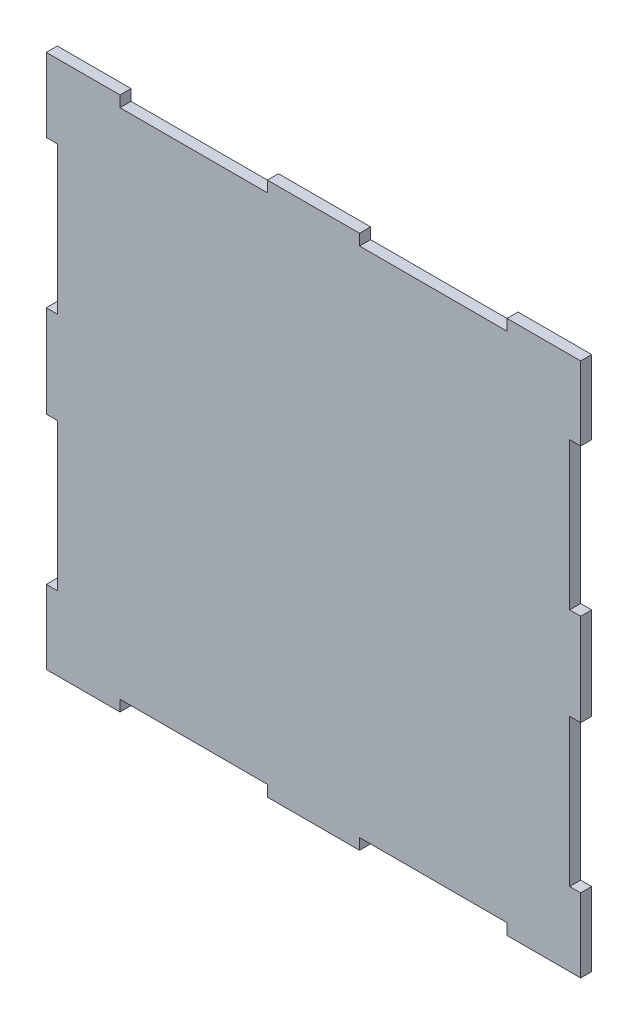
ISO-10303-21;
HEADER;
FILE_DESCRIPTION(('STEP AP214'),'2;1');
FILE_NAME('part.step','',(''),(''),'','','');
FILE_SCHEMA(('AUTOMOTIVE_DESIGN { 1 0 10303 214 1 1 1 1 }'));
ENDSEC;
DATA;
#1=APPLICATION_CONTEXT('core data for automotive mechanical design processes');
#2=APPLICATION_PROTOCOL_DEFINITION('international standard','automotive_design',2000,#1);
#3=PRODUCT_CONTEXT('',#1,'mechanical');
#4=PRODUCT('Part','Part','',(#3));
#5=PRODUCT_RELATED_PRODUCT_CATEGORY('part','',(#4));
#6=PRODUCT_DEFINITION_FORMATION('','',#4);
#7=PRODUCT_DEFINITION_CONTEXT('part definition',#1,'design');
#8=PRODUCT_DEFINITION('design','',#6,#7);
#9=PRODUCT_DEFINITION_SHAPE('','',#8);
#10=(LENGTH_UNIT() NAMED_UNIT(*) SI_UNIT(.MILLI.,.METRE.));
#11=(NAMED_UNIT(*) PLANE_ANGLE_UNIT() SI_UNIT($,.RADIAN.));
#12=(NAMED_UNIT(*) SI_UNIT($,.STERADIAN.) SOLID_ANGLE_UNIT());
#13=UNCERTAINTY_MEASURE_WITH_UNIT(LENGTH_MEASURE(1.E-05),#10,'distance_accuracy_value','');
#14=(GEOMETRIC_REPRESENTATION_CONTEXT(3) GLOBAL_UNCERTAINTY_ASSIGNED_CONTEXT((#13)) GLOBAL_UNIT_ASSIGNED_CONTEXT((#10,
#11,#12)) REPRESENTATION_CONTEXT('',''));
#15=CARTESIAN_POINT('',(0.,0.,0.));
#16=DIRECTION('',(0.,0.,1.));
#17=DIRECTION('',(1.,0.,0.));
#18=AXIS2_PLACEMENT_3D('',#15,#16,#17);
#19=CARTESIAN_POINT('',(72.5,72.5,3.));
#20=DIRECTION('',(-1.,0.,0.));
#21=DIRECTION('',(0.,-1.,0.));
#22=AXIS2_PLACEMENT_3D('',#19,#20,#21);
#23=PLANE('',#22);
#24=DIRECTION('',(0.,1.,0.));
#25=VECTOR('',#24,1.);
#26=CARTESIAN_POINT('',(72.5,72.5,3.));
#27=LINE('',#26,#25);
#28=CARTESIAN_POINT('',(72.5,-12.5,3.));
#29=VERTEX_POINT('',#28);
#30=CARTESIAN_POINT('',(72.5,12.5,3.));
#31=VERTEX_POINT('',#30);
#32=EDGE_CURVE('E377',#29,#31,#27,.T.);
#33=ORIENTED_EDGE('',*,*,#32,.F.);
#34=DIRECTION('',(0.,0.,1.));
#35=VECTOR('',#34,1.);
#36=CARTESIAN_POINT('',(72.5,-12.5,0.));
#37=LINE('',#36,#35);
#38=CARTESIAN_POINT('',(72.5,-12.5,0.));
#39=VERTEX_POINT('',#38);
#40=EDGE_CURVE('E406',#39,#29,#37,.T.);
#41=ORIENTED_EDGE('',*,*,#40,.F.);
#42=DIRECTION('',(0.,1.,0.));
#43=VECTOR('',#42,1.);
#44=CARTESIAN_POINT('',(72.5,72.5,0.));
#45=LINE('',#44,#43);
#46=CARTESIAN_POINT('',(72.5,12.5,0.));
#47=VERTEX_POINT('',#46);
#48=EDGE_CURVE('E345',#39,#47,#45,.T.);
#49=ORIENTED_EDGE('',*,*,#48,.T.);
#50=DIRECTION('',(0.,0.,1.));
#51=VECTOR('',#50,1.);
#52=CARTESIAN_POINT('',(72.5,12.5,0.));
#53=LINE('',#52,#51);
#54=EDGE_CURVE('E438',#47,#31,#53,.T.);
#55=ORIENTED_EDGE('',*,*,#54,.T.);
#56=EDGE_LOOP('',(#33,#41,#49,#55));
#57=FACE_BOUND('',#56,.T.);
#58=ADVANCED_FACE('F32',(#57),#23,.F.);
#59=CARTESIAN_POINT('',(72.5,52.5,3.));
#60=VERTEX_POINT('',#59);
#61=CARTESIAN_POINT('',(72.5,72.5,3.));
#62=VERTEX_POINT('',#61);
#63=EDGE_CURVE('E298',#60,#62,#27,.T.);
#64=ORIENTED_EDGE('',*,*,#63,.F.);
#65=DIRECTION('',(0.,0.,1.));
#66=VECTOR('',#65,1.);
#67=CARTESIAN_POINT('',(72.5,52.5,0.));
#68=LINE('',#67,#66);
#69=CARTESIAN_POINT('',(72.5,52.5,0.));
#70=VERTEX_POINT('',#69);
#71=EDGE_CURVE('E435',#70,#60,#68,.T.);
#72=ORIENTED_EDGE('',*,*,#71,.F.);
#73=CARTESIAN_POINT('',(72.5,72.5,0.));
#74=VERTEX_POINT('',#73);
#75=EDGE_CURVE('E346',#70,#74,#45,.T.);
#76=ORIENTED_EDGE('',*,*,#75,.T.);
#77=DIRECTION('',(0.,0.,-1.));
#78=VECTOR('',#77,1.);
#79=CARTESIAN_POINT('',(72.5,72.5,3.));
#80=LINE('',#79,#78);
#81=EDGE_CURVE('E11',#62,#74,#80,.T.);
#82=ORIENTED_EDGE('',*,*,#81,.F.);
#83=EDGE_LOOP('',(#64,#72,#76,#82));
#84=FACE_BOUND('',#83,.T.);
#85=ADVANCED_FACE('F568',(#84),#23,.F.);
#86=CARTESIAN_POINT('',(-72.5,72.5,3.));
#87=DIRECTION('',(0.,-1.,0.));
#88=DIRECTION('',(0.,0.,-1.));
#89=AXIS2_PLACEMENT_3D('',#86,#87,#88);
#90=PLANE('',#89);
#91=DIRECTION('',(-1.,0.,0.));
#92=VECTOR('',#91,1.);
#93=CARTESIAN_POINT('',(-72.5,72.5,3.));
#94=LINE('',#93,#92);
#95=CARTESIAN_POINT('',(12.5,72.5,3.));
#96=VERTEX_POINT('',#95);
#97=CARTESIAN_POINT('',(-12.5,72.5,3.));
#98=VERTEX_POINT('',#97);
#99=EDGE_CURVE('E382',#96,#98,#94,.T.);
#100=ORIENTED_EDGE('',*,*,#99,.F.);
#101=DIRECTION('',(0.,0.,1.));
#102=VECTOR('',#101,1.);
#103=CARTESIAN_POINT('',(12.5,72.5,0.));
#104=LINE('',#103,#102);
#105=CARTESIAN_POINT('',(12.5,72.5,0.));
#106=VERTEX_POINT('',#105);
#107=EDGE_CURVE('E461',#106,#96,#104,.T.);
#108=ORIENTED_EDGE('',*,*,#107,.F.);
#109=DIRECTION('',(-1.,0.,0.));
#110=VECTOR('',#109,1.);
#111=CARTESIAN_POINT('',(-72.5,72.5,0.));
#112=LINE('',#111,#110);
#113=CARTESIAN_POINT('',(-12.5,72.5,0.));
#114=VERTEX_POINT('',#113);
#115=EDGE_CURVE('E336',#106,#114,#112,.T.);
#116=ORIENTED_EDGE('',*,*,#115,.T.);
#117=DIRECTION('',(0.,0.,1.));
#118=VECTOR('',#117,1.);
#119=CARTESIAN_POINT('',(-12.5,72.5,0.));
#120=LINE('',#119,#118);
#121=EDGE_CURVE('E357',#114,#98,#120,.T.);
#122=ORIENTED_EDGE('',*,*,#121,.T.);
#123=EDGE_LOOP('',(#100,#108,#116,#122));
#124=FACE_BOUND('',#123,.T.);
#125=ADVANCED_FACE('F554',(#124),#90,.F.);
#126=CARTESIAN_POINT('',(-52.5,72.5,3.));
#127=VERTEX_POINT('',#126);
#128=CARTESIAN_POINT('',(-72.5,72.5,3.));
#129=VERTEX_POINT('',#128);
#130=EDGE_CURVE('E376',#127,#129,#94,.T.);
#131=ORIENTED_EDGE('',*,*,#130,.F.);
#132=DIRECTION('',(0.,0.,1.));
#133=VECTOR('',#132,1.);
#134=CARTESIAN_POINT('',(-52.5,72.5,0.));
#135=LINE('',#134,#133);
#136=CARTESIAN_POINT('',(-52.5,72.5,0.));
#137=VERTEX_POINT('',#136);
#138=EDGE_CURVE('E352',#137,#127,#135,.T.);
#139=ORIENTED_EDGE('',*,*,#138,.F.);
#140=CARTESIAN_POINT('',(-72.5,72.5,0.));
#141=VERTEX_POINT('',#140);
#142=EDGE_CURVE('E324',#137,#141,#112,.T.);
#143=ORIENTED_EDGE('',*,*,#142,.T.);
#144=DIRECTION('',(0.,0.,-1.));
#145=VECTOR('',#144,1.);
#146=CARTESIAN_POINT('',(-72.5,72.5,3.));
#147=LINE('',#146,#145);
#148=EDGE_CURVE('E40',#129,#141,#147,.T.);
#149=ORIENTED_EDGE('',*,*,#148,.F.);
#150=EDGE_LOOP('',(#131,#139,#143,#149));
#151=FACE_BOUND('',#150,.T.);
#152=ADVANCED_FACE('F558',(#151),#90,.F.);
#153=CARTESIAN_POINT('',(-72.5,72.5,3.));
#154=DIRECTION('',(1.,0.,0.));
#155=DIRECTION('',(0.,0.,-1.));
#156=AXIS2_PLACEMENT_3D('',#153,#154,#155);
#157=PLANE('',#156);
#158=DIRECTION('',(0.,-1.,0.));
#159=VECTOR('',#158,1.);
#160=CARTESIAN_POINT('',(-72.5,72.5,0.));
#161=LINE('',#160,#159);
#162=CARTESIAN_POINT('',(-72.5,52.5,0.));
#163=VERTEX_POINT('',#162);
#164=EDGE_CURVE('E299',#141,#163,#161,.T.);
#165=ORIENTED_EDGE('',*,*,#164,.T.);
#166=DIRECTION('',(0.,0.,1.));
#167=VECTOR('',#166,1.);
#168=CARTESIAN_POINT('',(-72.5,52.5,0.));
#169=LINE('',#168,#167);
#170=CARTESIAN_POINT('',(-72.5,52.5,3.));
#171=VERTEX_POINT('',#170);
#172=EDGE_CURVE('E457',#163,#171,#169,.T.);
#173=ORIENTED_EDGE('',*,*,#172,.T.);
#174=DIRECTION('',(0.,-1.,0.));
#175=VECTOR('',#174,1.);
#176=CARTESIAN_POINT('',(-72.5,72.5,3.));
#177=LINE('',#176,#175);
#178=EDGE_CURVE('E318',#129,#171,#177,.T.);
#179=ORIENTED_EDGE('',*,*,#178,.F.);
#180=ORIENTED_EDGE('',*,*,#148,.T.);
#181=EDGE_LOOP('',(#165,#173,#179,#180));
#182=FACE_BOUND('',#181,.T.);
#183=ADVANCED_FACE('F315',(#182),#157,.F.);
#184=CARTESIAN_POINT('',(-72.5,12.5,3.));
#185=VERTEX_POINT('',#184);
#186=CARTESIAN_POINT('',(-72.5,-12.5,3.));
#187=VERTEX_POINT('',#186);
#188=EDGE_CURVE('E384',#185,#187,#177,.T.);
#189=ORIENTED_EDGE('',*,*,#188,.F.);
#190=DIRECTION('',(0.,0.,1.));
#191=VECTOR('',#190,1.);
#192=CARTESIAN_POINT('',(-72.5,12.5,0.));
#193=LINE('',#192,#191);
#194=CARTESIAN_POINT('',(-72.5,12.5,0.));
#195=VERTEX_POINT('',#194);
#196=EDGE_CURVE('E475',#195,#185,#193,.T.);
#197=ORIENTED_EDGE('',*,*,#196,.F.);
#198=CARTESIAN_POINT('',(-72.5,-12.5,0.));
#199=VERTEX_POINT('',#198);
#200=EDGE_CURVE('E327',#195,#199,#161,.T.);
#201=ORIENTED_EDGE('',*,*,#200,.T.);
#202=DIRECTION('',(0.,0.,1.));
#203=VECTOR('',#202,1.);
#204=CARTESIAN_POINT('',(-72.5,-12.5,0.));
#205=LINE('',#204,#203);
#206=EDGE_CURVE('E480',#199,#187,#205,.T.);
#207=ORIENTED_EDGE('',*,*,#206,.T.);
#208=EDGE_LOOP('',(#189,#197,#201,#207));
#209=FACE_BOUND('',#208,.T.);
#210=ADVANCED_FACE('F565',(#209),#157,.F.);
#211=CARTESIAN_POINT('',(-72.5,-72.5,3.));
#212=DIRECTION('',(0.,1.,0.));
#213=DIRECTION('',(0.,0.,1.));
#214=AXIS2_PLACEMENT_3D('',#211,#212,#213);
#215=PLANE('',#214);
#216=DIRECTION('',(1.,0.,0.));
#217=VECTOR('',#216,1.);
#218=CARTESIAN_POINT('',(-72.5,-72.5,0.));
#219=LINE('',#218,#217);
#220=CARTESIAN_POINT('',(-12.5,-72.5,0.));
#221=VERTEX_POINT('',#220);
#222=CARTESIAN_POINT('',(12.5,-72.5,0.));
#223=VERTEX_POINT('',#222);
#224=EDGE_CURVE('E283',#221,#223,#219,.T.);
#225=ORIENTED_EDGE('',*,*,#224,.T.);
#226=DIRECTION('',(0.,0.,1.));
#227=VECTOR('',#226,1.);
#228=CARTESIAN_POINT('',(12.5,-72.5,0.));
#229=LINE('',#228,#227);
#230=CARTESIAN_POINT('',(12.5,-72.5,3.));
#231=VERTEX_POINT('',#230);
#232=EDGE_CURVE('E505',#223,#231,#229,.T.);
#233=ORIENTED_EDGE('',*,*,#232,.T.);
#234=DIRECTION('',(1.,0.,0.));
#235=VECTOR('',#234,1.);
#236=CARTESIAN_POINT('',(-72.5,-72.5,3.));
#237=LINE('',#236,#235);
#238=CARTESIAN_POINT('',(-12.5,-72.5,3.));
#239=VERTEX_POINT('',#238);
#240=EDGE_CURVE('E285',#239,#231,#237,.T.);
#241=ORIENTED_EDGE('',*,*,#240,.F.);
#242=DIRECTION('',(0.,0.,1.));
#243=VECTOR('',#242,1.);
#244=CARTESIAN_POINT('',(-12.5,-72.5,0.));
#245=LINE('',#244,#243);
#246=EDGE_CURVE('E269',#221,#239,#245,.T.);
#247=ORIENTED_EDGE('',*,*,#246,.F.);
#248=EDGE_LOOP('',(#225,#233,#241,#247));
#249=FACE_BOUND('',#248,.T.);
#250=ADVANCED_FACE('F281',(#249),#215,.F.);
#251=CARTESIAN_POINT('',(-72.5,-72.5,0.));
#252=VERTEX_POINT('',#251);
#253=CARTESIAN_POINT('',(-52.5,-72.5,0.));
#254=VERTEX_POINT('',#253);
#255=EDGE_CURVE('E294',#252,#254,#219,.T.);
#256=ORIENTED_EDGE('',*,*,#255,.T.);
#257=DIRECTION('',(0.,0.,1.));
#258=VECTOR('',#257,1.);
#259=CARTESIAN_POINT('',(-52.5,-72.5,0.));
#260=LINE('',#259,#258);
#261=CARTESIAN_POINT('',(-52.5,-72.5,3.));
#262=VERTEX_POINT('',#261);
#263=EDGE_CURVE('E526',#254,#262,#260,.T.);
#264=ORIENTED_EDGE('',*,*,#263,.T.);
#265=CARTESIAN_POINT('',(-72.5,-72.5,3.));
#266=VERTEX_POINT('',#265);
#267=EDGE_CURVE('E307',#266,#262,#237,.T.);
#268=ORIENTED_EDGE('',*,*,#267,.F.);
#269=DIRECTION('',(0.,0.,-1.));
#270=VECTOR('',#269,1.);
#271=CARTESIAN_POINT('',(-72.5,-72.5,3.));
#272=LINE('',#271,#270);
#273=EDGE_CURVE('E306',#266,#252,#272,.T.);
#274=ORIENTED_EDGE('',*,*,#273,.T.);
#275=EDGE_LOOP('',(#256,#264,#268,#274));
#276=FACE_BOUND('',#275,.T.);
#277=ADVANCED_FACE('F577',(#276),#215,.F.);
#278=CARTESIAN_POINT('',(72.5,-72.5,0.));
#279=VERTEX_POINT('',#278);
#280=CARTESIAN_POINT('',(72.5,-52.5,0.));
#281=VERTEX_POINT('',#280);
#282=EDGE_CURVE('E342',#279,#281,#45,.T.);
#283=ORIENTED_EDGE('',*,*,#282,.T.);
#284=DIRECTION('',(0.,0.,1.));
#285=VECTOR('',#284,1.);
#286=CARTESIAN_POINT('',(72.5,-52.5,0.));
#287=LINE('',#286,#285);
#288=CARTESIAN_POINT('',(72.5,-52.5,3.));
#289=VERTEX_POINT('',#288);
#290=EDGE_CURVE('E403',#281,#289,#287,.T.);
#291=ORIENTED_EDGE('',*,*,#290,.T.);
#292=CARTESIAN_POINT('',(72.5,-72.5,3.));
#293=VERTEX_POINT('',#292);
#294=EDGE_CURVE('E373',#293,#289,#27,.T.);
#295=ORIENTED_EDGE('',*,*,#294,.F.);
#296=DIRECTION('',(0.,0.,-1.));
#297=VECTOR('',#296,1.);
#298=CARTESIAN_POINT('',(72.5,-72.5,3.));
#299=LINE('',#298,#297);
#300=EDGE_CURVE('E303',#293,#279,#299,.T.);
#301=ORIENTED_EDGE('',*,*,#300,.T.);
#302=EDGE_LOOP('',(#283,#291,#295,#301));
#303=FACE_BOUND('',#302,.T.);
#304=ADVANCED_FACE('F34',(#303),#23,.F.);
#305=CARTESIAN_POINT('',(52.5,72.5,0.));
#306=VERTEX_POINT('',#305);
#307=EDGE_CURVE('E330',#74,#306,#112,.T.);
#308=ORIENTED_EDGE('',*,*,#307,.T.);
#309=DIRECTION('',(0.,0.,1.));
#310=VECTOR('',#309,1.);
#311=CARTESIAN_POINT('',(52.5,72.5,0.));
#312=LINE('',#311,#310);
#313=CARTESIAN_POINT('',(52.5,72.5,3.));
#314=VERTEX_POINT('',#313);
#315=EDGE_CURVE('E464',#306,#314,#312,.T.);
#316=ORIENTED_EDGE('',*,*,#315,.T.);
#317=EDGE_CURVE('E378',#62,#314,#94,.T.);
#318=ORIENTED_EDGE('',*,*,#317,.F.);
#319=ORIENTED_EDGE('',*,*,#81,.T.);
#320=EDGE_LOOP('',(#308,#316,#318,#319));
#321=FACE_BOUND('',#320,.T.);
#322=ADVANCED_FACE('F560',(#321),#90,.F.);
#323=CARTESIAN_POINT('',(-72.5,-52.5,3.));
#324=VERTEX_POINT('',#323);
#325=EDGE_CURVE('E381',#324,#266,#177,.T.);
#326=ORIENTED_EDGE('',*,*,#325,.F.);
#327=DIRECTION('',(0.,0.,1.));
#328=VECTOR('',#327,1.);
#329=CARTESIAN_POINT('',(-72.5,-52.5,0.));
#330=LINE('',#329,#328);
#331=CARTESIAN_POINT('',(-72.5,-52.5,0.));
#332=VERTEX_POINT('',#331);
#333=EDGE_CURVE('E500',#332,#324,#330,.T.);
#334=ORIENTED_EDGE('',*,*,#333,.F.);
#335=EDGE_CURVE('E328',#332,#252,#161,.T.);
#336=ORIENTED_EDGE('',*,*,#335,.T.);
#337=ORIENTED_EDGE('',*,*,#273,.F.);
#338=EDGE_LOOP('',(#326,#334,#336,#337));
#339=FACE_BOUND('',#338,.T.);
#340=ADVANCED_FACE('F567',(#339),#157,.F.);
#341=CARTESIAN_POINT('',(52.5,-72.5,3.));
#342=VERTEX_POINT('',#341);
#343=EDGE_CURVE('E383',#342,#293,#237,.T.);
#344=ORIENTED_EDGE('',*,*,#343,.F.);
#345=DIRECTION('',(0.,0.,1.));
#346=VECTOR('',#345,1.);
#347=CARTESIAN_POINT('',(52.5,-72.5,0.));
#348=LINE('',#347,#346);
#349=CARTESIAN_POINT('',(52.5,-72.5,0.));
#350=VERTEX_POINT('',#349);
#351=EDGE_CURVE('E523',#350,#342,#348,.T.);
#352=ORIENTED_EDGE('',*,*,#351,.F.);
#353=EDGE_CURVE('E295',#350,#279,#219,.T.);
#354=ORIENTED_EDGE('',*,*,#353,.T.);
#355=ORIENTED_EDGE('',*,*,#300,.F.);
#356=EDGE_LOOP('',(#344,#352,#354,#355));
#357=FACE_BOUND('',#356,.T.);
#358=ADVANCED_FACE('F401',(#357),#215,.F.);
#359=CARTESIAN_POINT('',(0.,0.,3.));
#360=DIRECTION('',(0.,0.,1.));
#361=DIRECTION('',(1.,0.,0.));
#362=AXIS2_PLACEMENT_3D('',#359,#360,#361);
#363=PLANE('',#362);
#364=DIRECTION('',(0.,-1.,0.));
#365=VECTOR('',#364,1.);
#366=CARTESIAN_POINT('',(12.5,72.5,3.));
#367=LINE('',#366,#365);
#368=CARTESIAN_POINT('',(12.5,69.5,3.));
#369=VERTEX_POINT('',#368);
#370=EDGE_CURVE('E453',#96,#369,#367,.T.);
#371=ORIENTED_EDGE('',*,*,#370,.F.);
#372=ORIENTED_EDGE('',*,*,#99,.T.);
#373=DIRECTION('',(0.,1.,0.));
#374=VECTOR('',#373,1.);
#375=CARTESIAN_POINT('',(-12.5,72.5,3.));
#376=LINE('',#375,#374);
#377=CARTESIAN_POINT('',(-12.5,69.5,3.));
#378=VERTEX_POINT('',#377);
#379=EDGE_CURVE('E366',#378,#98,#376,.T.);
#380=ORIENTED_EDGE('',*,*,#379,.F.);
#381=DIRECTION('',(1.,0.,0.));
#382=VECTOR('',#381,1.);
#383=CARTESIAN_POINT('',(-52.5,69.5,3.));
#384=LINE('',#383,#382);
#385=CARTESIAN_POINT('',(-52.5,69.5,3.));
#386=VERTEX_POINT('',#385);
#387=EDGE_CURVE('E543',#386,#378,#384,.T.);
#388=ORIENTED_EDGE('',*,*,#387,.F.);
#389=DIRECTION('',(0.,-1.,0.));
#390=VECTOR('',#389,1.);
#391=CARTESIAN_POINT('',(-52.5,72.5,3.));
#392=LINE('',#391,#390);
#393=EDGE_CURVE('E463',#127,#386,#392,.T.);
#394=ORIENTED_EDGE('',*,*,#393,.F.);
#395=ORIENTED_EDGE('',*,*,#130,.T.);
#396=ORIENTED_EDGE('',*,*,#178,.T.);
#397=DIRECTION('',(-1.,0.,0.));
#398=VECTOR('',#397,1.);
#399=CARTESIAN_POINT('',(-72.5,52.5,3.));
#400=LINE('',#399,#398);
#401=CARTESIAN_POINT('',(-69.5,52.5,3.));
#402=VERTEX_POINT('',#401);
#403=EDGE_CURVE('E472',#402,#171,#400,.T.);
#404=ORIENTED_EDGE('',*,*,#403,.F.);
#405=DIRECTION('',(0.,1.,0.));
#406=VECTOR('',#405,1.);
#407=CARTESIAN_POINT('',(-69.5,52.5,3.));
#408=LINE('',#407,#406);
#409=CARTESIAN_POINT('',(-69.5,12.5,3.));
#410=VERTEX_POINT('',#409);
#411=EDGE_CURVE('E479',#410,#402,#408,.T.);
#412=ORIENTED_EDGE('',*,*,#411,.F.);
#413=DIRECTION('',(1.,0.,0.));
#414=VECTOR('',#413,1.);
#415=CARTESIAN_POINT('',(-72.5,12.5,3.));
#416=LINE('',#415,#414);
#417=EDGE_CURVE('E476',#185,#410,#416,.T.);
#418=ORIENTED_EDGE('',*,*,#417,.F.);
#419=ORIENTED_EDGE('',*,*,#188,.T.);
#420=DIRECTION('',(-1.,0.,0.));
#421=VECTOR('',#420,1.);
#422=CARTESIAN_POINT('',(-72.5,-12.5,3.));
#423=LINE('',#422,#421);
#424=CARTESIAN_POINT('',(-69.5,-12.5,3.));
#425=VERTEX_POINT('',#424);
#426=EDGE_CURVE('E494',#425,#187,#423,.T.);
#427=ORIENTED_EDGE('',*,*,#426,.F.);
#428=DIRECTION('',(0.,1.,0.));
#429=VECTOR('',#428,1.);
#430=CARTESIAN_POINT('',(-69.5,-12.5,3.));
#431=LINE('',#430,#429);
#432=CARTESIAN_POINT('',(-69.5,-52.5,3.));
#433=VERTEX_POINT('',#432);
#434=EDGE_CURVE('E504',#433,#425,#431,.T.);
#435=ORIENTED_EDGE('',*,*,#434,.F.);
#436=DIRECTION('',(1.,0.,0.));
#437=VECTOR('',#436,1.);
#438=CARTESIAN_POINT('',(-72.5,-52.5,3.));
#439=LINE('',#438,#437);
#440=EDGE_CURVE('E501',#324,#433,#439,.T.);
#441=ORIENTED_EDGE('',*,*,#440,.F.);
#442=ORIENTED_EDGE('',*,*,#325,.T.);
#443=ORIENTED_EDGE('',*,*,#267,.T.);
#444=DIRECTION('',(0.,-1.,0.));
#445=VECTOR('',#444,1.);
#446=CARTESIAN_POINT('',(-52.5,-72.5,3.));
#447=LINE('',#446,#445);
#448=CARTESIAN_POINT('',(-52.5,-69.5,3.));
#449=VERTEX_POINT('',#448);
#450=EDGE_CURVE('E276',#449,#262,#447,.T.);
#451=ORIENTED_EDGE('',*,*,#450,.F.);
#452=DIRECTION('',(-1.,0.,0.));
#453=VECTOR('',#452,1.);
#454=CARTESIAN_POINT('',(-52.5,-69.5,3.));
#455=LINE('',#454,#453);
#456=CARTESIAN_POINT('',(-12.5,-69.5,3.));
#457=VERTEX_POINT('',#456);
#458=EDGE_CURVE('E742',#457,#449,#455,.T.);
#459=ORIENTED_EDGE('',*,*,#458,.F.);
#460=DIRECTION('',(0.,1.,0.));
#461=VECTOR('',#460,1.);
#462=CARTESIAN_POINT('',(-12.5,-72.5,3.));
#463=LINE('',#462,#461);
#464=EDGE_CURVE('E409',#239,#457,#463,.T.);
#465=ORIENTED_EDGE('',*,*,#464,.F.);
#466=ORIENTED_EDGE('',*,*,#240,.T.);
#467=DIRECTION('',(0.,-1.,0.));
#468=VECTOR('',#467,1.);
#469=CARTESIAN_POINT('',(12.5,-72.5,3.));
#470=LINE('',#469,#468);
#471=CARTESIAN_POINT('',(12.5,-69.5,3.));
#472=VERTEX_POINT('',#471);
#473=EDGE_CURVE('E520',#472,#231,#470,.T.);
#474=ORIENTED_EDGE('',*,*,#473,.F.);
#475=DIRECTION('',(-1.,0.,0.));
#476=VECTOR('',#475,1.);
#477=CARTESIAN_POINT('',(12.5,-69.5,3.));
#478=LINE('',#477,#476);
#479=CARTESIAN_POINT('',(52.5,-69.5,3.));
#480=VERTEX_POINT('',#479);
#481=EDGE_CURVE('E525',#480,#472,#478,.T.);
#482=ORIENTED_EDGE('',*,*,#481,.F.);
#483=DIRECTION('',(0.,1.,0.));
#484=VECTOR('',#483,1.);
#485=CARTESIAN_POINT('',(52.5,-72.5,3.));
#486=LINE('',#485,#484);
#487=EDGE_CURVE('E398',#342,#480,#486,.T.);
#488=ORIENTED_EDGE('',*,*,#487,.F.);
#489=ORIENTED_EDGE('',*,*,#343,.T.);
#490=ORIENTED_EDGE('',*,*,#294,.T.);
#491=DIRECTION('',(1.,0.,0.));
#492=VECTOR('',#491,1.);
#493=CARTESIAN_POINT('',(72.5,-52.5,3.));
#494=LINE('',#493,#492);
#495=CARTESIAN_POINT('',(69.5,-52.5,3.));
#496=VERTEX_POINT('',#495);
#497=EDGE_CURVE('E624',#496,#289,#494,.T.);
#498=ORIENTED_EDGE('',*,*,#497,.F.);
#499=DIRECTION('',(0.,-1.,0.));
#500=VECTOR('',#499,1.);
#501=CARTESIAN_POINT('',(69.5,-12.5,3.));
#502=LINE('',#501,#500);
#503=CARTESIAN_POINT('',(69.5,-12.5,3.));
#504=VERTEX_POINT('',#503);
#505=EDGE_CURVE('E630',#504,#496,#502,.T.);
#506=ORIENTED_EDGE('',*,*,#505,.F.);
#507=DIRECTION('',(-1.,0.,0.));
#508=VECTOR('',#507,1.);
#509=CARTESIAN_POINT('',(72.5,-12.5,3.));
#510=LINE('',#509,#508);
#511=EDGE_CURVE('E437',#29,#504,#510,.T.);
#512=ORIENTED_EDGE('',*,*,#511,.F.);
#513=ORIENTED_EDGE('',*,*,#32,.T.);
#514=DIRECTION('',(1.,0.,0.));
#515=VECTOR('',#514,1.);
#516=CARTESIAN_POINT('',(72.5,12.5,3.));
#517=LINE('',#516,#515);
#518=CARTESIAN_POINT('',(69.5,12.5,3.));
#519=VERTEX_POINT('',#518);
#520=EDGE_CURVE('E421',#519,#31,#517,.T.);
#521=ORIENTED_EDGE('',*,*,#520,.F.);
#522=DIRECTION('',(0.,-1.,0.));
#523=VECTOR('',#522,1.);
#524=CARTESIAN_POINT('',(69.5,52.5,3.));
#525=LINE('',#524,#523);
#526=CARTESIAN_POINT('',(69.5,52.5,3.));
#527=VERTEX_POINT('',#526);
#528=EDGE_CURVE('E431',#527,#519,#525,.T.);
#529=ORIENTED_EDGE('',*,*,#528,.F.);
#530=DIRECTION('',(-1.,0.,0.));
#531=VECTOR('',#530,1.);
#532=CARTESIAN_POINT('',(72.5,52.5,3.));
#533=LINE('',#532,#531);
#534=EDGE_CURVE('E428',#60,#527,#533,.T.);
#535=ORIENTED_EDGE('',*,*,#534,.F.);
#536=ORIENTED_EDGE('',*,*,#63,.T.);
#537=ORIENTED_EDGE('',*,*,#317,.T.);
#538=DIRECTION('',(0.,1.,0.));
#539=VECTOR('',#538,1.);
#540=CARTESIAN_POINT('',(52.5,72.5,3.));
#541=LINE('',#540,#539);
#542=CARTESIAN_POINT('',(52.5,69.5,3.));
#543=VERTEX_POINT('',#542);
#544=EDGE_CURVE('E448',#543,#314,#541,.T.);
#545=ORIENTED_EDGE('',*,*,#544,.F.);
#546=DIRECTION('',(1.,0.,0.));
#547=VECTOR('',#546,1.);
#548=CARTESIAN_POINT('',(12.5,69.5,3.));
#549=LINE('',#548,#547);
#550=EDGE_CURVE('E456',#369,#543,#549,.T.);
#551=ORIENTED_EDGE('',*,*,#550,.F.);
#552=EDGE_LOOP('',(#371,#372,#380,#388,#394,#395,#396,#404,#412,#418,#419,#427,#435,#441,#442,
#443,#451,#459,#465,#466,#474,#482,#488,#489,#490,#498,#506,#512,#513,#521,#529,#535,#536,#537,
#545,#551));
#553=FACE_BOUND('',#552,.T.);
#554=ADVANCED_FACE('F393',(#553),#363,.T.);
#555=CARTESIAN_POINT('',(0.,0.,0.));
#556=DIRECTION('',(0.,0.,1.));
#557=DIRECTION('',(1.,0.,0.));
#558=AXIS2_PLACEMENT_3D('',#555,#556,#557);
#559=PLANE('',#558);
#560=ORIENTED_EDGE('',*,*,#115,.F.);
#561=DIRECTION('',(0.,-1.,0.));
#562=VECTOR('',#561,1.);
#563=CARTESIAN_POINT('',(12.5,72.5,0.));
#564=LINE('',#563,#562);
#565=CARTESIAN_POINT('',(12.5,69.5,0.));
#566=VERTEX_POINT('',#565);
#567=EDGE_CURVE('E444',#106,#566,#564,.T.);
#568=ORIENTED_EDGE('',*,*,#567,.T.);
#569=DIRECTION('',(1.,0.,0.));
#570=VECTOR('',#569,1.);
#571=CARTESIAN_POINT('',(12.5,69.5,0.));
#572=LINE('',#571,#570);
#573=CARTESIAN_POINT('',(52.5,69.5,0.));
#574=VERTEX_POINT('',#573);
#575=EDGE_CURVE('E447',#566,#574,#572,.T.);
#576=ORIENTED_EDGE('',*,*,#575,.T.);
#577=DIRECTION('',(0.,1.,0.));
#578=VECTOR('',#577,1.);
#579=CARTESIAN_POINT('',(52.5,72.5,0.));
#580=LINE('',#579,#578);
#581=EDGE_CURVE('E47',#574,#306,#580,.T.);
#582=ORIENTED_EDGE('',*,*,#581,.T.);
#583=ORIENTED_EDGE('',*,*,#307,.F.);
#584=ORIENTED_EDGE('',*,*,#75,.F.);
#585=DIRECTION('',(-1.,0.,0.));
#586=VECTOR('',#585,1.);
#587=CARTESIAN_POINT('',(72.5,52.5,0.));
#588=LINE('',#587,#586);
#589=CARTESIAN_POINT('',(69.5,52.5,0.));
#590=VERTEX_POINT('',#589);
#591=EDGE_CURVE('E417',#70,#590,#588,.T.);
#592=ORIENTED_EDGE('',*,*,#591,.T.);
#593=DIRECTION('',(0.,-1.,0.));
#594=VECTOR('',#593,1.);
#595=CARTESIAN_POINT('',(69.5,52.5,0.));
#596=LINE('',#595,#594);
#597=CARTESIAN_POINT('',(69.5,12.5,0.));
#598=VERTEX_POINT('',#597);
#599=EDGE_CURVE('E420',#590,#598,#596,.T.);
#600=ORIENTED_EDGE('',*,*,#599,.T.);
#601=DIRECTION('',(1.,0.,0.));
#602=VECTOR('',#601,1.);
#603=CARTESIAN_POINT('',(72.5,12.5,0.));
#604=LINE('',#603,#602);
#605=EDGE_CURVE('E424',#598,#47,#604,.T.);
#606=ORIENTED_EDGE('',*,*,#605,.T.);
#607=ORIENTED_EDGE('',*,*,#48,.F.);
#608=DIRECTION('',(-1.,0.,0.));
#609=VECTOR('',#608,1.);
#610=CARTESIAN_POINT('',(72.5,-12.5,0.));
#611=LINE('',#610,#609);
#612=CARTESIAN_POINT('',(69.5,-12.5,0.));
#613=VERTEX_POINT('',#612);
#614=EDGE_CURVE('E620',#39,#613,#611,.T.);
#615=ORIENTED_EDGE('',*,*,#614,.T.);
#616=DIRECTION('',(0.,-1.,0.));
#617=VECTOR('',#616,1.);
#618=CARTESIAN_POINT('',(69.5,-12.5,0.));
#619=LINE('',#618,#617);
#620=CARTESIAN_POINT('',(69.5,-52.5,0.));
#621=VERTEX_POINT('',#620);
#622=EDGE_CURVE('E623',#613,#621,#619,.T.);
#623=ORIENTED_EDGE('',*,*,#622,.T.);
#624=DIRECTION('',(1.,0.,0.));
#625=VECTOR('',#624,1.);
#626=CARTESIAN_POINT('',(72.5,-52.5,0.));
#627=LINE('',#626,#625);
#628=EDGE_CURVE('E416',#621,#281,#627,.T.);
#629=ORIENTED_EDGE('',*,*,#628,.T.);
#630=ORIENTED_EDGE('',*,*,#282,.F.);
#631=ORIENTED_EDGE('',*,*,#353,.F.);
#632=DIRECTION('',(0.,1.,0.));
#633=VECTOR('',#632,1.);
#634=CARTESIAN_POINT('',(52.5,-72.5,0.));
#635=LINE('',#634,#633);
#636=CARTESIAN_POINT('',(52.5,-69.5,0.));
#637=VERTEX_POINT('',#636);
#638=EDGE_CURVE('E516',#350,#637,#635,.T.);
#639=ORIENTED_EDGE('',*,*,#638,.T.);
#640=DIRECTION('',(-1.,0.,0.));
#641=VECTOR('',#640,1.);
#642=CARTESIAN_POINT('',(12.5,-69.5,0.));
#643=LINE('',#642,#641);
#644=CARTESIAN_POINT('',(12.5,-69.5,0.));
#645=VERTEX_POINT('',#644);
#646=EDGE_CURVE('E519',#637,#645,#643,.T.);
#647=ORIENTED_EDGE('',*,*,#646,.T.);
#648=DIRECTION('',(0.,-1.,0.));
#649=VECTOR('',#648,1.);
#650=CARTESIAN_POINT('',(12.5,-72.5,0.));
#651=LINE('',#650,#649);
#652=EDGE_CURVE('E293',#645,#223,#651,.T.);
#653=ORIENTED_EDGE('',*,*,#652,.T.);
#654=ORIENTED_EDGE('',*,*,#224,.F.);
#655=DIRECTION('',(0.,1.,0.));
#656=VECTOR('',#655,1.);
#657=CARTESIAN_POINT('',(-12.5,-72.5,0.));
#658=LINE('',#657,#656);
#659=CARTESIAN_POINT('',(-12.5,-69.5,0.));
#660=VERTEX_POINT('',#659);
#661=EDGE_CURVE('E265',#221,#660,#658,.T.);
#662=ORIENTED_EDGE('',*,*,#661,.T.);
#663=DIRECTION('',(-1.,0.,0.));
#664=VECTOR('',#663,1.);
#665=CARTESIAN_POINT('',(-52.5,-69.5,0.));
#666=LINE('',#665,#664);
#667=CARTESIAN_POINT('',(-52.5,-69.5,0.));
#668=VERTEX_POINT('',#667);
#669=EDGE_CURVE('E275',#660,#668,#666,.T.);
#670=ORIENTED_EDGE('',*,*,#669,.T.);
#671=DIRECTION('',(0.,-1.,0.));
#672=VECTOR('',#671,1.);
#673=CARTESIAN_POINT('',(-52.5,-72.5,0.));
#674=LINE('',#673,#672);
#675=EDGE_CURVE('E286',#668,#254,#674,.T.);
#676=ORIENTED_EDGE('',*,*,#675,.T.);
#677=ORIENTED_EDGE('',*,*,#255,.F.);
#678=ORIENTED_EDGE('',*,*,#335,.F.);
#679=DIRECTION('',(1.,0.,0.));
#680=VECTOR('',#679,1.);
#681=CARTESIAN_POINT('',(-72.5,-52.5,0.));
#682=LINE('',#681,#680);
#683=CARTESIAN_POINT('',(-69.5,-52.5,0.));
#684=VERTEX_POINT('',#683);
#685=EDGE_CURVE('E490',#332,#684,#682,.T.);
#686=ORIENTED_EDGE('',*,*,#685,.T.);
#687=DIRECTION('',(0.,1.,0.));
#688=VECTOR('',#687,1.);
#689=CARTESIAN_POINT('',(-69.5,-12.5,0.));
#690=LINE('',#689,#688);
#691=CARTESIAN_POINT('',(-69.5,-12.5,0.));
#692=VERTEX_POINT('',#691);
#693=EDGE_CURVE('E493',#684,#692,#690,.T.);
#694=ORIENTED_EDGE('',*,*,#693,.T.);
#695=DIRECTION('',(-1.,0.,0.));
#696=VECTOR('',#695,1.);
#697=CARTESIAN_POINT('',(-72.5,-12.5,0.));
#698=LINE('',#697,#696);
#699=EDGE_CURVE('E497',#692,#199,#698,.T.);
#700=ORIENTED_EDGE('',*,*,#699,.T.);
#701=ORIENTED_EDGE('',*,*,#200,.F.);
#702=DIRECTION('',(1.,0.,0.));
#703=VECTOR('',#702,1.);
#704=CARTESIAN_POINT('',(-72.5,12.5,0.));
#705=LINE('',#704,#703);
#706=CARTESIAN_POINT('',(-69.5,12.5,0.));
#707=VERTEX_POINT('',#706);
#708=EDGE_CURVE('E469',#195,#707,#705,.T.);
#709=ORIENTED_EDGE('',*,*,#708,.T.);
#710=DIRECTION('',(0.,1.,0.));
#711=VECTOR('',#710,1.);
#712=CARTESIAN_POINT('',(-69.5,52.5,0.));
#713=LINE('',#712,#711);
#714=CARTESIAN_POINT('',(-69.5,52.5,0.));
#715=VERTEX_POINT('',#714);
#716=EDGE_CURVE('E55',#707,#715,#713,.T.);
#717=ORIENTED_EDGE('',*,*,#716,.T.);
#718=DIRECTION('',(-1.,0.,0.));
#719=VECTOR('',#718,1.);
#720=CARTESIAN_POINT('',(-72.5,52.5,0.));
#721=LINE('',#720,#719);
#722=EDGE_CURVE('E326',#715,#163,#721,.T.);
#723=ORIENTED_EDGE('',*,*,#722,.T.);
#724=ORIENTED_EDGE('',*,*,#164,.F.);
#725=ORIENTED_EDGE('',*,*,#142,.F.);
#726=DIRECTION('',(0.,-1.,0.));
#727=VECTOR('',#726,1.);
#728=CARTESIAN_POINT('',(-52.5,72.5,0.));
#729=LINE('',#728,#727);
#730=CARTESIAN_POINT('',(-52.5,69.5,0.));
#731=VERTEX_POINT('',#730);
#732=EDGE_CURVE('E536',#137,#731,#729,.T.);
#733=ORIENTED_EDGE('',*,*,#732,.T.);
#734=DIRECTION('',(1.,0.,0.));
#735=VECTOR('',#734,1.);
#736=CARTESIAN_POINT('',(-52.5,69.5,0.));
#737=LINE('',#736,#735);
#738=CARTESIAN_POINT('',(-12.5,69.5,0.));
#739=VERTEX_POINT('',#738);
#740=EDGE_CURVE('E538',#731,#739,#737,.T.);
#741=ORIENTED_EDGE('',*,*,#740,.T.);
#742=DIRECTION('',(0.,1.,0.));
#743=VECTOR('',#742,1.);
#744=CARTESIAN_POINT('',(-12.5,72.5,0.));
#745=LINE('',#744,#743);
#746=EDGE_CURVE('E372',#739,#114,#745,.T.);
#747=ORIENTED_EDGE('',*,*,#746,.T.);
#748=EDGE_LOOP('',(#560,#568,#576,#582,#583,#584,#592,#600,#606,#607,#615,#623,#629,#630,#631,
#639,#647,#653,#654,#662,#670,#676,#677,#678,#686,#694,#700,#701,#709,#717,#723,#724,#725,#733,
#741,#747));
#749=FACE_BOUND('',#748,.T.);
#750=ADVANCED_FACE('F290',(#749),#559,.F.);
#751=CARTESIAN_POINT('',(-52.5,72.5,0.));
#752=DIRECTION('',(-1.,0.,0.));
#753=DIRECTION('',(0.,0.,1.));
#754=AXIS2_PLACEMENT_3D('',#751,#752,#753);
#755=PLANE('',#754);
#756=ORIENTED_EDGE('',*,*,#393,.T.);
#757=DIRECTION('',(0.,0.,1.));
#758=VECTOR('',#757,1.);
#759=CARTESIAN_POINT('',(-52.5,69.5,0.));
#760=LINE('',#759,#758);
#761=EDGE_CURVE('E370',#731,#386,#760,.T.);
#762=ORIENTED_EDGE('',*,*,#761,.F.);
#763=ORIENTED_EDGE('',*,*,#732,.F.);
#764=ORIENTED_EDGE('',*,*,#138,.T.);
#765=EDGE_LOOP('',(#756,#762,#763,#764));
#766=FACE_BOUND('',#765,.T.);
#767=ADVANCED_FACE('F664',(#766),#755,.F.);
#768=CARTESIAN_POINT('',(-12.5,72.5,0.));
#769=DIRECTION('',(1.,0.,0.));
#770=DIRECTION('',(0.,0.,-1.));
#771=AXIS2_PLACEMENT_3D('',#768,#769,#770);
#772=PLANE('',#771);
#773=ORIENTED_EDGE('',*,*,#379,.T.);
#774=ORIENTED_EDGE('',*,*,#121,.F.);
#775=ORIENTED_EDGE('',*,*,#746,.F.);
#776=DIRECTION('',(0.,0.,1.));
#777=VECTOR('',#776,1.);
#778=CARTESIAN_POINT('',(-12.5,69.5,0.));
#779=LINE('',#778,#777);
#780=EDGE_CURVE('E363',#739,#378,#779,.T.);
#781=ORIENTED_EDGE('',*,*,#780,.T.);
#782=EDGE_LOOP('',(#773,#774,#775,#781));
#783=FACE_BOUND('',#782,.T.);
#784=ADVANCED_FACE('F550',(#783),#772,.F.);
#785=CARTESIAN_POINT('',(-52.5,69.5,0.));
#786=DIRECTION('',(0.,-1.,0.));
#787=DIRECTION('',(0.,0.,-1.));
#788=AXIS2_PLACEMENT_3D('',#785,#786,#787);
#789=PLANE('',#788);
#790=ORIENTED_EDGE('',*,*,#387,.T.);
#791=ORIENTED_EDGE('',*,*,#780,.F.);
#792=ORIENTED_EDGE('',*,*,#740,.F.);
#793=ORIENTED_EDGE('',*,*,#761,.T.);
#794=EDGE_LOOP('',(#790,#791,#792,#793));
#795=FACE_BOUND('',#794,.T.);
#796=ADVANCED_FACE('F663',(#795),#789,.F.);
#797=CARTESIAN_POINT('',(72.5,52.5,0.));
#798=DIRECTION('',(0.,1.,0.));
#799=DIRECTION('',(-1.,0.,0.));
#800=AXIS2_PLACEMENT_3D('',#797,#798,#799);
#801=PLANE('',#800);
#802=ORIENTED_EDGE('',*,*,#534,.T.);
#803=DIRECTION('',(0.,0.,1.));
#804=VECTOR('',#803,1.);
#805=CARTESIAN_POINT('',(69.5,52.5,0.));
#806=LINE('',#805,#804);
#807=EDGE_CURVE('E427',#590,#527,#806,.T.);
#808=ORIENTED_EDGE('',*,*,#807,.F.);
#809=ORIENTED_EDGE('',*,*,#591,.F.);
#810=ORIENTED_EDGE('',*,*,#71,.T.);
#811=EDGE_LOOP('',(#802,#808,#809,#810));
#812=FACE_BOUND('',#811,.T.);
#813=ADVANCED_FACE('F674',(#812),#801,.F.);
#814=CARTESIAN_POINT('',(72.5,12.5,0.));
#815=DIRECTION('',(0.,-1.,0.));
#816=DIRECTION('',(0.,0.,-1.));
#817=AXIS2_PLACEMENT_3D('',#814,#815,#816);
#818=PLANE('',#817);
#819=ORIENTED_EDGE('',*,*,#520,.T.);
#820=ORIENTED_EDGE('',*,*,#54,.F.);
#821=ORIENTED_EDGE('',*,*,#605,.F.);
#822=DIRECTION('',(0.,0.,1.));
#823=VECTOR('',#822,1.);
#824=CARTESIAN_POINT('',(69.5,12.5,0.));
#825=LINE('',#824,#823);
#826=EDGE_CURVE('E441',#598,#519,#825,.T.);
#827=ORIENTED_EDGE('',*,*,#826,.T.);
#828=EDGE_LOOP('',(#819,#820,#821,#827));
#829=FACE_BOUND('',#828,.T.);
#830=ADVANCED_FACE('F647',(#829),#818,.F.);
#831=CARTESIAN_POINT('',(69.5,52.5,0.));
#832=DIRECTION('',(-1.,0.,0.));
#833=DIRECTION('',(0.,-1.,0.));
#834=AXIS2_PLACEMENT_3D('',#831,#832,#833);
#835=PLANE('',#834);
#836=ORIENTED_EDGE('',*,*,#528,.T.);
#837=ORIENTED_EDGE('',*,*,#826,.F.);
#838=ORIENTED_EDGE('',*,*,#599,.F.);
#839=ORIENTED_EDGE('',*,*,#807,.T.);
#840=EDGE_LOOP('',(#836,#837,#838,#839));
#841=FACE_BOUND('',#840,.T.);
#842=ADVANCED_FACE('F649',(#841),#835,.F.);
#843=CARTESIAN_POINT('',(72.5,-12.5,0.));
#844=DIRECTION('',(0.,1.,0.));
#845=DIRECTION('',(0.,0.,1.));
#846=AXIS2_PLACEMENT_3D('',#843,#844,#845);
#847=PLANE('',#846);
#848=ORIENTED_EDGE('',*,*,#511,.T.);
#849=DIRECTION('',(0.,0.,1.));
#850=VECTOR('',#849,1.);
#851=CARTESIAN_POINT('',(69.5,-12.5,0.));
#852=LINE('',#851,#850);
#853=EDGE_CURVE('E411',#613,#504,#852,.T.);
#854=ORIENTED_EDGE('',*,*,#853,.F.);
#855=ORIENTED_EDGE('',*,*,#614,.F.);
#856=ORIENTED_EDGE('',*,*,#40,.T.);
#857=EDGE_LOOP('',(#848,#854,#855,#856));
#858=FACE_BOUND('',#857,.T.);
#859=ADVANCED_FACE('F641',(#858),#847,.F.);
#860=CARTESIAN_POINT('',(72.5,-52.5,0.));
#861=DIRECTION('',(0.,-1.,0.));
#862=DIRECTION('',(1.,0.,0.));
#863=AXIS2_PLACEMENT_3D('',#860,#861,#862);
#864=PLANE('',#863);
#865=ORIENTED_EDGE('',*,*,#497,.T.);
#866=ORIENTED_EDGE('',*,*,#290,.F.);
#867=ORIENTED_EDGE('',*,*,#628,.F.);
#868=DIRECTION('',(0.,0.,1.));
#869=VECTOR('',#868,1.);
#870=CARTESIAN_POINT('',(69.5,-52.5,0.));
#871=LINE('',#870,#869);
#872=EDGE_CURVE('E407',#621,#496,#871,.T.);
#873=ORIENTED_EDGE('',*,*,#872,.T.);
#874=EDGE_LOOP('',(#865,#866,#867,#873));
#875=FACE_BOUND('',#874,.T.);
#876=ADVANCED_FACE('F632',(#875),#864,.F.);
#877=CARTESIAN_POINT('',(69.5,-12.5,0.));
#878=DIRECTION('',(-1.,0.,0.));
#879=DIRECTION('',(0.,-1.,0.));
#880=AXIS2_PLACEMENT_3D('',#877,#878,#879);
#881=PLANE('',#880);
#882=ORIENTED_EDGE('',*,*,#505,.T.);
#883=ORIENTED_EDGE('',*,*,#872,.F.);
#884=ORIENTED_EDGE('',*,*,#622,.F.);
#885=ORIENTED_EDGE('',*,*,#853,.T.);
#886=EDGE_LOOP('',(#882,#883,#884,#885));
#887=FACE_BOUND('',#886,.T.);
#888=ADVANCED_FACE('F638',(#887),#881,.F.);
#889=CARTESIAN_POINT('',(-52.5,-72.5,0.));
#890=DIRECTION('',(-1.,0.,0.));
#891=DIRECTION('',(0.,0.,1.));
#892=AXIS2_PLACEMENT_3D('',#889,#890,#891);
#893=PLANE('',#892);
#894=ORIENTED_EDGE('',*,*,#450,.T.);
#895=ORIENTED_EDGE('',*,*,#263,.F.);
#896=ORIENTED_EDGE('',*,*,#675,.F.);
#897=DIRECTION('',(0.,0.,1.));
#898=VECTOR('',#897,1.);
#899=CARTESIAN_POINT('',(-52.5,-69.5,0.));
#900=LINE('',#899,#898);
#901=EDGE_CURVE('E613',#668,#449,#900,.T.);
#902=ORIENTED_EDGE('',*,*,#901,.T.);
#903=EDGE_LOOP('',(#894,#895,#896,#902));
#904=FACE_BOUND('',#903,.T.);
#905=ADVANCED_FACE('F728',(#904),#893,.F.);
#906=CARTESIAN_POINT('',(-52.5,-69.5,0.));
#907=DIRECTION('',(0.,1.,0.));
#908=DIRECTION('',(-1.,0.,0.));
#909=AXIS2_PLACEMENT_3D('',#906,#907,#908);
#910=PLANE('',#909);
#911=ORIENTED_EDGE('',*,*,#458,.T.);
#912=ORIENTED_EDGE('',*,*,#901,.F.);
#913=ORIENTED_EDGE('',*,*,#669,.F.);
#914=DIRECTION('',(0.,0.,1.));
#915=VECTOR('',#914,1.);
#916=CARTESIAN_POINT('',(-12.5,-69.5,0.));
#917=LINE('',#916,#915);
#918=EDGE_CURVE('E271',#660,#457,#917,.T.);
#919=ORIENTED_EDGE('',*,*,#918,.T.);
#920=EDGE_LOOP('',(#911,#912,#913,#919));
#921=FACE_BOUND('',#920,.T.);
#922=ADVANCED_FACE('F733',(#921),#910,.F.);
#923=CARTESIAN_POINT('',(-12.5,-72.5,0.));
#924=DIRECTION('',(1.,0.,0.));
#925=DIRECTION('',(0.,0.,-1.));
#926=AXIS2_PLACEMENT_3D('',#923,#924,#925);
#927=PLANE('',#926);
#928=ORIENTED_EDGE('',*,*,#464,.T.);
#929=ORIENTED_EDGE('',*,*,#918,.F.);
#930=ORIENTED_EDGE('',*,*,#661,.F.);
#931=ORIENTED_EDGE('',*,*,#246,.T.);
#932=EDGE_LOOP('',(#928,#929,#930,#931));
#933=FACE_BOUND('',#932,.T.);
#934=ADVANCED_FACE('F268',(#933),#927,.F.);
#935=CARTESIAN_POINT('',(12.5,-72.5,0.));
#936=DIRECTION('',(-1.,0.,0.));
#937=DIRECTION('',(0.,0.,1.));
#938=AXIS2_PLACEMENT_3D('',#935,#936,#937);
#939=PLANE('',#938);
#940=ORIENTED_EDGE('',*,*,#473,.T.);
#941=ORIENTED_EDGE('',*,*,#232,.F.);
#942=ORIENTED_EDGE('',*,*,#652,.F.);
#943=DIRECTION('',(0.,0.,1.));
#944=VECTOR('',#943,1.);
#945=CARTESIAN_POINT('',(12.5,-69.5,0.));
#946=LINE('',#945,#944);
#947=EDGE_CURVE('E531',#645,#472,#946,.T.);
#948=ORIENTED_EDGE('',*,*,#947,.T.);
#949=EDGE_LOOP('',(#940,#941,#942,#948));
#950=FACE_BOUND('',#949,.T.);
#951=ADVANCED_FACE('F684',(#950),#939,.F.);
#952=CARTESIAN_POINT('',(12.5,-69.5,0.));
#953=DIRECTION('',(0.,1.,0.));
#954=DIRECTION('',(-1.,0.,0.));
#955=AXIS2_PLACEMENT_3D('',#952,#953,#954);
#956=PLANE('',#955);
#957=ORIENTED_EDGE('',*,*,#481,.T.);
#958=ORIENTED_EDGE('',*,*,#947,.F.);
#959=ORIENTED_EDGE('',*,*,#646,.F.);
#960=DIRECTION('',(0.,0.,1.));
#961=VECTOR('',#960,1.);
#962=CARTESIAN_POINT('',(52.5,-69.5,0.));
#963=LINE('',#962,#961);
#964=EDGE_CURVE('E533',#637,#480,#963,.T.);
#965=ORIENTED_EDGE('',*,*,#964,.T.);
#966=EDGE_LOOP('',(#957,#958,#959,#965));
#967=FACE_BOUND('',#966,.T.);
#968=ADVANCED_FACE('F680',(#967),#956,.F.);
#969=CARTESIAN_POINT('',(52.5,-72.5,0.));
#970=DIRECTION('',(1.,0.,0.));
#971=DIRECTION('',(0.,0.,-1.));
#972=AXIS2_PLACEMENT_3D('',#969,#970,#971);
#973=PLANE('',#972);
#974=ORIENTED_EDGE('',*,*,#487,.T.);
#975=ORIENTED_EDGE('',*,*,#964,.F.);
#976=ORIENTED_EDGE('',*,*,#638,.F.);
#977=ORIENTED_EDGE('',*,*,#351,.T.);
#978=EDGE_LOOP('',(#974,#975,#976,#977));
#979=FACE_BOUND('',#978,.T.);
#980=ADVANCED_FACE('F676',(#979),#973,.F.);
#981=CARTESIAN_POINT('',(-72.5,-12.5,0.));
#982=DIRECTION('',(0.,1.,0.));
#983=DIRECTION('',(0.,0.,1.));
#984=AXIS2_PLACEMENT_3D('',#981,#982,#983);
#985=PLANE('',#984);
#986=ORIENTED_EDGE('',*,*,#426,.T.);
#987=ORIENTED_EDGE('',*,*,#206,.F.);
#988=ORIENTED_EDGE('',*,*,#699,.F.);
#989=DIRECTION('',(0.,0.,1.));
#990=VECTOR('',#989,1.);
#991=CARTESIAN_POINT('',(-69.5,-12.5,0.));
#992=LINE('',#991,#990);
#993=EDGE_CURVE('E511',#692,#425,#992,.T.);
#994=ORIENTED_EDGE('',*,*,#993,.T.);
#995=EDGE_LOOP('',(#986,#987,#988,#994));
#996=FACE_BOUND('',#995,.T.);
#997=ADVANCED_FACE('F679',(#996),#985,.F.);
#998=CARTESIAN_POINT('',(-69.5,-12.5,0.));
#999=DIRECTION('',(1.,0.,0.));
#1000=DIRECTION('',(0.,1.,0.));
#1001=AXIS2_PLACEMENT_3D('',#998,#999,#1000);
#1002=PLANE('',#1001);
#1003=ORIENTED_EDGE('',*,*,#434,.T.);
#1004=ORIENTED_EDGE('',*,*,#993,.F.);
#1005=ORIENTED_EDGE('',*,*,#693,.F.);
#1006=DIRECTION('',(0.,0.,1.));
#1007=VECTOR('',#1006,1.);
#1008=CARTESIAN_POINT('',(-69.5,-52.5,0.));
#1009=LINE('',#1008,#1007);
#1010=EDGE_CURVE('E513',#684,#433,#1009,.T.);
#1011=ORIENTED_EDGE('',*,*,#1010,.T.);
#1012=EDGE_LOOP('',(#1003,#1004,#1005,#1011));
#1013=FACE_BOUND('',#1012,.T.);
#1014=ADVANCED_FACE('F693',(#1013),#1002,.F.);
#1015=CARTESIAN_POINT('',(-72.5,-52.5,0.));
#1016=DIRECTION('',(0.,-1.,0.));
#1017=DIRECTION('',(1.,0.,0.));
#1018=AXIS2_PLACEMENT_3D('',#1015,#1016,#1017);
#1019=PLANE('',#1018);
#1020=ORIENTED_EDGE('',*,*,#440,.T.);
#1021=ORIENTED_EDGE('',*,*,#1010,.F.);
#1022=ORIENTED_EDGE('',*,*,#685,.F.);
#1023=ORIENTED_EDGE('',*,*,#333,.T.);
#1024=EDGE_LOOP('',(#1020,#1021,#1022,#1023));
#1025=FACE_BOUND('',#1024,.T.);
#1026=ADVANCED_FACE('F689',(#1025),#1019,.F.);
#1027=CARTESIAN_POINT('',(-72.5,52.5,0.));
#1028=DIRECTION('',(0.,1.,0.));
#1029=DIRECTION('',(-1.,0.,0.));
#1030=AXIS2_PLACEMENT_3D('',#1027,#1028,#1029);
#1031=PLANE('',#1030);
#1032=ORIENTED_EDGE('',*,*,#403,.T.);
#1033=ORIENTED_EDGE('',*,*,#172,.F.);
#1034=ORIENTED_EDGE('',*,*,#722,.F.);
#1035=DIRECTION('',(0.,0.,1.));
#1036=VECTOR('',#1035,1.);
#1037=CARTESIAN_POINT('',(-69.5,52.5,0.));
#1038=LINE('',#1037,#1036);
#1039=EDGE_CURVE('E485',#715,#402,#1038,.T.);
#1040=ORIENTED_EDGE('',*,*,#1039,.T.);
#1041=EDGE_LOOP('',(#1032,#1033,#1034,#1040));
#1042=FACE_BOUND('',#1041,.T.);
#1043=ADVANCED_FACE('F692',(#1042),#1031,.F.);
#1044=CARTESIAN_POINT('',(-69.5,52.5,0.));
#1045=DIRECTION('',(1.,0.,0.));
#1046=DIRECTION('',(0.,1.,0.));
#1047=AXIS2_PLACEMENT_3D('',#1044,#1045,#1046);
#1048=PLANE('',#1047);
#1049=ORIENTED_EDGE('',*,*,#411,.T.);
#1050=ORIENTED_EDGE('',*,*,#1039,.F.);
#1051=ORIENTED_EDGE('',*,*,#716,.F.);
#1052=DIRECTION('',(0.,0.,1.));
#1053=VECTOR('',#1052,1.);
#1054=CARTESIAN_POINT('',(-69.5,12.5,0.));
#1055=LINE('',#1054,#1053);
#1056=EDGE_CURVE('E487',#707,#410,#1055,.T.);
#1057=ORIENTED_EDGE('',*,*,#1056,.T.);
#1058=EDGE_LOOP('',(#1049,#1050,#1051,#1057));
#1059=FACE_BOUND('',#1058,.T.);
#1060=ADVANCED_FACE('F704',(#1059),#1048,.F.);
#1061=CARTESIAN_POINT('',(-72.5,12.5,0.));
#1062=DIRECTION('',(0.,-1.,0.));
#1063=DIRECTION('',(0.,0.,-1.));
#1064=AXIS2_PLACEMENT_3D('',#1061,#1062,#1063);
#1065=PLANE('',#1064);
#1066=ORIENTED_EDGE('',*,*,#417,.T.);
#1067=ORIENTED_EDGE('',*,*,#1056,.F.);
#1068=ORIENTED_EDGE('',*,*,#708,.F.);
#1069=ORIENTED_EDGE('',*,*,#196,.T.);
#1070=EDGE_LOOP('',(#1066,#1067,#1068,#1069));
#1071=FACE_BOUND('',#1070,.T.);
#1072=ADVANCED_FACE('F701',(#1071),#1065,.F.);
#1073=CARTESIAN_POINT('',(12.5,72.5,0.));
#1074=DIRECTION('',(-1.,0.,0.));
#1075=DIRECTION('',(0.,0.,1.));
#1076=AXIS2_PLACEMENT_3D('',#1073,#1074,#1075);
#1077=PLANE('',#1076);
#1078=ORIENTED_EDGE('',*,*,#370,.T.);
#1079=DIRECTION('',(0.,0.,1.));
#1080=VECTOR('',#1079,1.);
#1081=CARTESIAN_POINT('',(12.5,69.5,0.));
#1082=LINE('',#1081,#1080);
#1083=EDGE_CURVE('E452',#566,#369,#1082,.T.);
#1084=ORIENTED_EDGE('',*,*,#1083,.F.);
#1085=ORIENTED_EDGE('',*,*,#567,.F.);
#1086=ORIENTED_EDGE('',*,*,#107,.T.);
#1087=EDGE_LOOP('',(#1078,#1084,#1085,#1086));
#1088=FACE_BOUND('',#1087,.T.);
#1089=ADVANCED_FACE('F661',(#1088),#1077,.F.);
#1090=CARTESIAN_POINT('',(52.5,72.5,0.));
#1091=DIRECTION('',(1.,0.,0.));
#1092=DIRECTION('',(0.,0.,-1.));
#1093=AXIS2_PLACEMENT_3D('',#1090,#1091,#1092);
#1094=PLANE('',#1093);
#1095=ORIENTED_EDGE('',*,*,#544,.T.);
#1096=ORIENTED_EDGE('',*,*,#315,.F.);
#1097=ORIENTED_EDGE('',*,*,#581,.F.);
#1098=DIRECTION('',(0.,0.,1.));
#1099=VECTOR('',#1098,1.);
#1100=CARTESIAN_POINT('',(52.5,69.5,0.));
#1101=LINE('',#1100,#1099);
#1102=EDGE_CURVE('E466',#574,#543,#1101,.T.);
#1103=ORIENTED_EDGE('',*,*,#1102,.T.);
#1104=EDGE_LOOP('',(#1095,#1096,#1097,#1103));
#1105=FACE_BOUND('',#1104,.T.);
#1106=ADVANCED_FACE('F656',(#1105),#1094,.F.);
#1107=CARTESIAN_POINT('',(12.5,69.5,0.));
#1108=DIRECTION('',(0.,-1.,0.));
#1109=DIRECTION('',(0.,0.,-1.));
#1110=AXIS2_PLACEMENT_3D('',#1107,#1108,#1109);
#1111=PLANE('',#1110);
#1112=ORIENTED_EDGE('',*,*,#550,.T.);
#1113=ORIENTED_EDGE('',*,*,#1102,.F.);
#1114=ORIENTED_EDGE('',*,*,#575,.F.);
#1115=ORIENTED_EDGE('',*,*,#1083,.T.);
#1116=EDGE_LOOP('',(#1112,#1113,#1114,#1115));
#1117=FACE_BOUND('',#1116,.T.);
#1118=ADVANCED_FACE('F659',(#1117),#1111,.F.);
#1119=CLOSED_SHELL('',(#58,#85,#125,#152,#183,#210,#250,#277,#304,#322,#340,#358,#554,#750,#767,
#784,#796,#813,#830,#842,#859,#876,#888,#905,#922,#934,#951,#968,#980,#997,#1014,#1026,#1043,
#1060,#1072,#1089,#1106,#1118));
#1120=MANIFOLD_SOLID_BREP('B2',#1119);
#1121=ADVANCED_BREP_SHAPE_REPRESENTATION('',(#18,#1120),#14);
#1122=SHAPE_DEFINITION_REPRESENTATION(#9,#1121);
ENDSEC;
END-ISO-10303-21;
